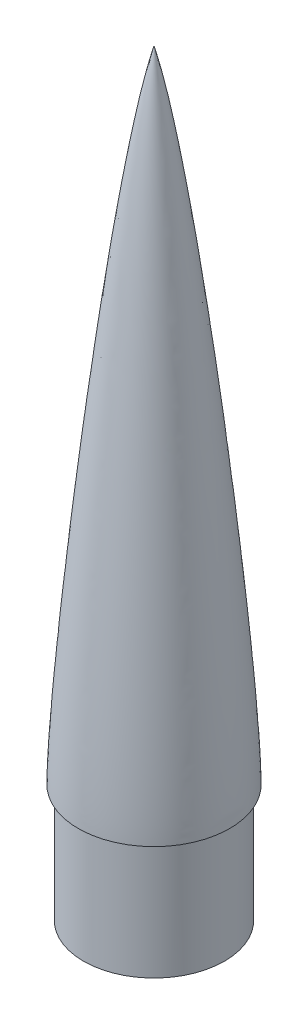
ISO-10303-21;
HEADER;
FILE_DESCRIPTION(('STEP AP214'),'2;1');
FILE_NAME('part.step','',(''),(''),'','','');
FILE_SCHEMA(('AUTOMOTIVE_DESIGN { 1 0 10303 214 1 1 1 1 }'));
ENDSEC;
DATA;
#1=APPLICATION_CONTEXT('core data for automotive mechanical design processes');
#2=APPLICATION_PROTOCOL_DEFINITION('international standard','automotive_design',2000,#1);
#3=PRODUCT_CONTEXT('',#1,'mechanical');
#4=PRODUCT('Part','Part','',(#3));
#5=PRODUCT_RELATED_PRODUCT_CATEGORY('part','',(#4));
#6=PRODUCT_DEFINITION_FORMATION('','',#4);
#7=PRODUCT_DEFINITION_CONTEXT('part definition',#1,'design');
#8=PRODUCT_DEFINITION('design','',#6,#7);
#9=PRODUCT_DEFINITION_SHAPE('','',#8);
#10=(LENGTH_UNIT() NAMED_UNIT(*) SI_UNIT(.MILLI.,.METRE.));
#11=(NAMED_UNIT(*) PLANE_ANGLE_UNIT() SI_UNIT($,.RADIAN.));
#12=(NAMED_UNIT(*) SI_UNIT($,.STERADIAN.) SOLID_ANGLE_UNIT());
#13=UNCERTAINTY_MEASURE_WITH_UNIT(LENGTH_MEASURE(1.E-05),#10,'distance_accuracy_value','');
#14=(GEOMETRIC_REPRESENTATION_CONTEXT(3) GLOBAL_UNCERTAINTY_ASSIGNED_CONTEXT((#13)) GLOBAL_UNIT_ASSIGNED_CONTEXT((#10,
#11,#12)) REPRESENTATION_CONTEXT('',''));
#15=CARTESIAN_POINT('',(0.,0.,0.));
#16=DIRECTION('',(0.,0.,1.));
#17=DIRECTION('',(1.,0.,0.));
#18=AXIS2_PLACEMENT_3D('',#15,#16,#17);
#19=CARTESIAN_POINT('',(0.,302.,0.));
#20=CARTESIAN_POINT('',(-11.9525104380581,259.848987743062,0.));
#21=CARTESIAN_POINT('',(-28.821778514965,95.9592984066351,0.));
#22=CARTESIAN_POINT('',(-29.,57.,0.));
#23=B_SPLINE_CURVE_WITH_KNOTS('',3,(#19,#20,#21,#22),.UNSPECIFIED.,.F.,.F.,(4,4),(0.,
0.89917678848461),.UNSPECIFIED.);
#24=CARTESIAN_POINT('',(0.,0.,0.));
#25=DIRECTION('',(0.,-1.,0.));
#26=AXIS1_PLACEMENT('',#24,#25);
#27=SURFACE_OF_REVOLUTION('',#23,#26);
#28=CARTESIAN_POINT('',(0.,57.,0.));
#29=DIRECTION('',(0.,-1.,0.));
#30=DIRECTION('',(0.,0.,-1.));
#31=AXIS2_PLACEMENT_3D('',#28,#29,#30);
#32=CIRCLE('',#31,29.);
#33=CARTESIAN_POINT('',(0.,57.,-29.));
#34=VERTEX_POINT('',#33);
#35=EDGE_CURVE('E11',#34,#34,#32,.T.);
#36=ORIENTED_EDGE('',*,*,#35,.F.);
#37=EDGE_LOOP('',(#36));
#38=FACE_BOUND('',#37,.T.);
#39=CARTESIAN_POINT('',(0.,302.,0.));
#40=VERTEX_POINT('',#39);
#41=VERTEX_LOOP('',#40);
#42=FACE_BOUND('',#41,.T.);
#43=ADVANCED_FACE('F37',(#38,#42),#27,.T.);
#44=CARTESIAN_POINT('',(-27.,57.,0.));
#45=DIRECTION('',(0.,1.,0.));
#46=DIRECTION('',(0.,0.,1.));
#47=AXIS2_PLACEMENT_3D('',#44,#45,#46);
#48=PLANE('',#47);
#49=CARTESIAN_POINT('',(0.,57.,0.));
#50=DIRECTION('',(0.,-1.,0.));
#51=DIRECTION('',(0.,0.,-1.));
#52=AXIS2_PLACEMENT_3D('',#49,#50,#51);
#53=CIRCLE('',#52,27.);
#54=CARTESIAN_POINT('',(0.,57.,-27.));
#55=VERTEX_POINT('',#54);
#56=EDGE_CURVE('E44',#55,#55,#53,.T.);
#57=ORIENTED_EDGE('',*,*,#56,.F.);
#58=EDGE_LOOP('',(#57));
#59=FACE_BOUND('',#58,.T.);
#60=ORIENTED_EDGE('',*,*,#35,.T.);
#61=EDGE_LOOP('',(#60));
#62=FACE_BOUND('',#61,.T.);
#63=ADVANCED_FACE('F48',(#59,#62),#48,.F.);
#64=CARTESIAN_POINT('',(0.,0.,0.));
#65=DIRECTION('',(0.,-1.,0.));
#66=DIRECTION('',(0.,0.,-1.));
#67=AXIS2_PLACEMENT_3D('',#64,#65,#66);
#68=CYLINDRICAL_SURFACE('',#67,27.);
#69=CARTESIAN_POINT('',(0.,12.,0.));
#70=DIRECTION('',(0.,-1.,0.));
#71=DIRECTION('',(0.,0.,-1.));
#72=AXIS2_PLACEMENT_3D('',#69,#70,#71);
#73=CIRCLE('',#72,27.);
#74=CARTESIAN_POINT('',(0.,12.,27.));
#75=VERTEX_POINT('',#74);
#76=EDGE_CURVE('E83',#75,#75,#73,.T.);
#77=ORIENTED_EDGE('',*,*,#76,.F.);
#78=EDGE_LOOP('',(#77));
#79=FACE_BOUND('',#78,.T.);
#80=ORIENTED_EDGE('',*,*,#56,.T.);
#81=EDGE_LOOP('',(#80));
#82=FACE_BOUND('',#81,.T.);
#83=ADVANCED_FACE('F53',(#79,#82),#68,.T.);
#84=CARTESIAN_POINT('',(0.,12.,0.));
#85=DIRECTION('',(0.,1.,0.));
#86=DIRECTION('',(0.,0.,1.));
#87=AXIS2_PLACEMENT_3D('',#84,#85,#86);
#88=CONICAL_SURFACE('',#87,27.,1.34229968750303);
#89=CARTESIAN_POINT('',(0.,7.,0.));
#90=DIRECTION('',(0.,-1.,0.));
#91=DIRECTION('',(0.,0.,-1.));
#92=AXIS2_PLACEMENT_3D('',#89,#90,#91);
#93=CIRCLE('',#92,5.5);
#94=CARTESIAN_POINT('',(0.,7.,5.5));
#95=VERTEX_POINT('',#94);
#96=EDGE_CURVE('E80',#95,#95,#93,.T.);
#97=CARTESIAN_POINT('',(0.,7.,5.5));
#98=CARTESIAN_POINT('',(0.,7.05208333333333,5.72395833333333));
#99=CARTESIAN_POINT('',(0.,7.10416666666667,5.94791666666667));
#100=CARTESIAN_POINT('',(0.,7.20833333333333,6.39583333333333));
#101=CARTESIAN_POINT('',(0.,7.26041666666667,6.61979166666667));
#102=CARTESIAN_POINT('',(0.,7.36458333333333,7.06770833333333));
#103=CARTESIAN_POINT('',(0.,7.41666666666667,7.29166666666667));
#104=CARTESIAN_POINT('',(0.,7.52083333333333,7.73958333333333));
#105=CARTESIAN_POINT('',(0.,7.57291666666667,7.96354166666666));
#106=CARTESIAN_POINT('',(0.,7.67708333333333,8.41145833333333));
#107=CARTESIAN_POINT('',(0.,7.72916666666667,8.63541666666666));
#108=CARTESIAN_POINT('',(0.,7.83333333333333,9.08333333333333));
#109=CARTESIAN_POINT('',(0.,7.88541666666667,9.30729166666667));
#110=CARTESIAN_POINT('',(0.,7.98958333333333,9.75520833333333));
#111=CARTESIAN_POINT('',(0.,8.04166666666667,9.97916666666667));
#112=CARTESIAN_POINT('',(0.,8.14583333333333,10.4270833333333));
#113=CARTESIAN_POINT('',(0.,8.19791666666667,10.6510416666667));
#114=CARTESIAN_POINT('',(0.,8.30208333333333,11.0989583333333));
#115=CARTESIAN_POINT('',(0.,8.35416666666667,11.3229166666667));
#116=CARTESIAN_POINT('',(0.,8.45833333333333,11.7708333333333));
#117=CARTESIAN_POINT('',(0.,8.51041666666667,11.9947916666667));
#118=CARTESIAN_POINT('',(0.,8.61458333333333,12.4427083333333));
#119=CARTESIAN_POINT('',(0.,8.66666666666667,12.6666666666667));
#120=CARTESIAN_POINT('',(0.,8.77083333333333,13.1145833333333));
#121=CARTESIAN_POINT('',(0.,8.82291666666667,13.3385416666667));
#122=CARTESIAN_POINT('',(0.,8.92708333333333,13.7864583333333));
#123=CARTESIAN_POINT('',(0.,8.97916666666666,14.0104166666667));
#124=CARTESIAN_POINT('',(0.,9.08333333333333,14.4583333333333));
#125=CARTESIAN_POINT('',(0.,9.13541666666666,14.6822916666667));
#126=CARTESIAN_POINT('',(0.,9.23958333333333,15.1302083333333));
#127=CARTESIAN_POINT('',(0.,9.29166666666666,15.3541666666667));
#128=CARTESIAN_POINT('',(0.,9.39583333333333,15.8020833333333));
#129=CARTESIAN_POINT('',(0.,9.44791666666667,16.0260416666667));
#130=CARTESIAN_POINT('',(0.,9.55208333333333,16.4739583333333));
#131=CARTESIAN_POINT('',(0.,9.60416666666666,16.6979166666667));
#132=CARTESIAN_POINT('',(0.,9.70833333333333,17.1458333333333));
#133=CARTESIAN_POINT('',(0.,9.76041666666667,17.3697916666667));
#134=CARTESIAN_POINT('',(0.,9.86458333333333,17.8177083333333));
#135=CARTESIAN_POINT('',(0.,9.91666666666667,18.0416666666667));
#136=CARTESIAN_POINT('',(0.,10.0208333333333,18.4895833333333));
#137=CARTESIAN_POINT('',(0.,10.0729166666667,18.7135416666667));
#138=CARTESIAN_POINT('',(0.,10.1770833333333,19.1614583333333));
#139=CARTESIAN_POINT('',(0.,10.2291666666667,19.3854166666667));
#140=CARTESIAN_POINT('',(0.,10.3333333333333,19.8333333333333));
#141=CARTESIAN_POINT('',(0.,10.3854166666667,20.0572916666667));
#142=CARTESIAN_POINT('',(0.,10.4895833333333,20.5052083333333));
#143=CARTESIAN_POINT('',(0.,10.5416666666667,20.7291666666667));
#144=CARTESIAN_POINT('',(0.,10.6458333333333,21.1770833333333));
#145=CARTESIAN_POINT('',(0.,10.6979166666667,21.4010416666667));
#146=CARTESIAN_POINT('',(0.,10.8020833333333,21.8489583333333));
#147=CARTESIAN_POINT('',(0.,10.8541666666667,22.0729166666667));
#148=CARTESIAN_POINT('',(0.,10.9583333333333,22.5208333333333));
#149=CARTESIAN_POINT('',(0.,11.0104166666667,22.7447916666667));
#150=CARTESIAN_POINT('',(0.,11.1145833333333,23.1927083333333));
#151=CARTESIAN_POINT('',(0.,11.1666666666667,23.4166666666667));
#152=CARTESIAN_POINT('',(0.,11.2708333333333,23.8645833333333));
#153=CARTESIAN_POINT('',(0.,11.3229166666667,24.0885416666667));
#154=CARTESIAN_POINT('',(0.,11.4270833333333,24.5364583333333));
#155=CARTESIAN_POINT('',(0.,11.4791666666667,24.7604166666667));
#156=CARTESIAN_POINT('',(0.,11.5833333333333,25.2083333333333));
#157=CARTESIAN_POINT('',(0.,11.6354166666667,25.4322916666667));
#158=CARTESIAN_POINT('',(0.,11.7395833333333,25.8802083333333));
#159=CARTESIAN_POINT('',(0.,11.7916666666667,26.1041666666667));
#160=CARTESIAN_POINT('',(0.,11.8958333333333,26.5520833333333));
#161=CARTESIAN_POINT('',(0.,11.9479166666667,26.7760416666667));
#162=CARTESIAN_POINT('',(0.,12.,27.));
#163=B_SPLINE_CURVE_WITH_KNOTS('',3,(#97,#98,#99,#100,#101,#102,#103,#104,#105,#106,#107,#108,
#109,#110,#111,#112,#113,#114,#115,#116,#117,#118,#119,#120,#121,#122,#123,#124,#125,#126,#127,
#128,#129,#130,#131,#132,#133,#134,#135,#136,#137,#138,#139,#140,#141,#142,#143,#144,#145,#146,
#147,#148,#149,#150,#151,#152,#153,#154,#155,#156,#157,#158,#159,#160,#161,#162),.UNSPECIFIED.,
.F.,.F.,(4,2,2,2,2,2,2,2,2,2,2,2,2,2,2,2,2,2,2,2,2,2,2,2,2,2,2,2,2,2,2,2,4),(0.,
0.689804376707631,1.37960875341526,2.06941313012289,2.75921750683051,3.44902188353814,
4.13882626024578,4.8286306369534,5.51843501366103,6.20823939036866,6.89804376707629,
7.58784814378392,8.27765252049154,8.96745689719917,9.6572612739068,10.3470656506144,
11.0368700273221,11.7266744040297,12.4164787807373,13.1062831574449,13.7960875341526,
14.4858919108602,15.1756962875678,15.8655006642755,16.5553050409831,17.2451094176907,
17.9349137943983,18.624718171106,19.3145225478136,20.0043269245212,20.6941313012289,
21.3839356779365,22.0737400546441),.UNSPECIFIED.);
#164=EDGE_CURVE('BSEAM60',#95,#75,#163,.T.);
#165=ORIENTED_EDGE('',*,*,#96,.F.);
#166=ORIENTED_EDGE('',*,*,#76,.T.);
#167=ORIENTED_EDGE('',*,*,#164,.T.);
#168=ORIENTED_EDGE('',*,*,#164,.F.);
#169=EDGE_LOOP('',(#165,#167,#166,#168));
#170=FACE_BOUND('',#169,.T.);
#171=ADVANCED_FACE('F60',(#170),#88,.T.);
#172=CARTESIAN_POINT('',(0.,0.,0.));
#173=DIRECTION('',(0.,-1.,0.));
#174=DIRECTION('',(0.,0.,-1.));
#175=AXIS2_PLACEMENT_3D('',#172,#173,#174);
#176=CYLINDRICAL_SURFACE('',#175,5.5);
#177=CARTESIAN_POINT('',(0.,0.,0.));
#178=DIRECTION('',(0.,-1.,0.));
#179=DIRECTION('',(0.,0.,-1.));
#180=AXIS2_PLACEMENT_3D('',#177,#178,#179);
#181=CIRCLE('',#180,5.5);
#182=CARTESIAN_POINT('',(0.,0.,-5.5));
#183=VERTEX_POINT('',#182);
#184=EDGE_CURVE('E79',#183,#183,#181,.T.);
#185=ORIENTED_EDGE('',*,*,#184,.F.);
#186=EDGE_LOOP('',(#185));
#187=FACE_BOUND('',#186,.T.);
#188=ORIENTED_EDGE('',*,*,#96,.T.);
#189=EDGE_LOOP('',(#188));
#190=FACE_BOUND('',#189,.T.);
#191=ADVANCED_FACE('F67',(#187,#190),#176,.T.);
#192=CARTESIAN_POINT('',(0.,0.,0.));
#193=DIRECTION('',(0.,1.,0.));
#194=DIRECTION('',(0.,0.,1.));
#195=AXIS2_PLACEMENT_3D('',#192,#193,#194);
#196=PLANE('',#195);
#197=ORIENTED_EDGE('',*,*,#184,.T.);
#198=EDGE_LOOP('',(#197));
#199=FACE_BOUND('',#198,.T.);
#200=ADVANCED_FACE('F71',(#199),#196,.F.);
#201=CLOSED_SHELL('',(#43,#63,#83,#171,#191,#200));
#202=MANIFOLD_SOLID_BREP('B2',#201);
#203=ADVANCED_BREP_SHAPE_REPRESENTATION('',(#18,#202),#14);
#204=SHAPE_DEFINITION_REPRESENTATION(#9,#203);
ENDSEC;
END-ISO-10303-21;
